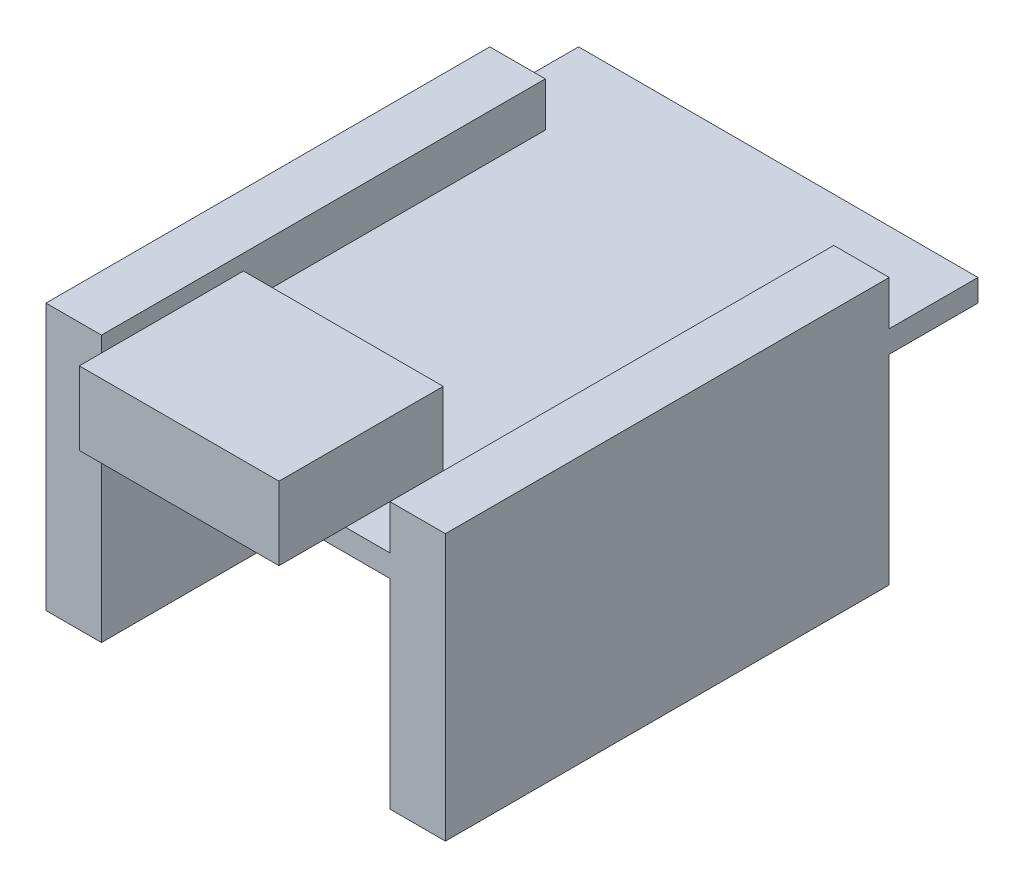
ISO-10303-21;
HEADER;
FILE_DESCRIPTION(('STEP AP214'),'2;1');
FILE_NAME('part.step','',(''),(''),'','','');
FILE_SCHEMA(('AUTOMOTIVE_DESIGN { 1 0 10303 214 1 1 1 1 }'));
ENDSEC;
DATA;
#1=APPLICATION_CONTEXT('core data for automotive mechanical design processes');
#2=APPLICATION_PROTOCOL_DEFINITION('international standard','automotive_design',2000,#1);
#3=PRODUCT_CONTEXT('',#1,'mechanical');
#4=PRODUCT('Part','Part','',(#3));
#5=PRODUCT_RELATED_PRODUCT_CATEGORY('part','',(#4));
#6=PRODUCT_DEFINITION_FORMATION('','',#4);
#7=PRODUCT_DEFINITION_CONTEXT('part definition',#1,'design');
#8=PRODUCT_DEFINITION('design','',#6,#7);
#9=PRODUCT_DEFINITION_SHAPE('','',#8);
#10=(LENGTH_UNIT() NAMED_UNIT(*) SI_UNIT(.MILLI.,.METRE.));
#11=(NAMED_UNIT(*) PLANE_ANGLE_UNIT() SI_UNIT($,.RADIAN.));
#12=(NAMED_UNIT(*) SI_UNIT($,.STERADIAN.) SOLID_ANGLE_UNIT());
#13=UNCERTAINTY_MEASURE_WITH_UNIT(LENGTH_MEASURE(1.E-05),#10,'distance_accuracy_value','');
#14=(GEOMETRIC_REPRESENTATION_CONTEXT(3) GLOBAL_UNCERTAINTY_ASSIGNED_CONTEXT((#13)) GLOBAL_UNIT_ASSIGNED_CONTEXT((#10,
#11,#12)) REPRESENTATION_CONTEXT('',''));
#15=CARTESIAN_POINT('',(0.,0.,0.));
#16=DIRECTION('',(0.,0.,1.));
#17=DIRECTION('',(1.,0.,0.));
#18=AXIS2_PLACEMENT_3D('',#15,#16,#17);
#19=CARTESIAN_POINT('',(9.,1.,-12.));
#20=DIRECTION('',(-1.,0.,0.));
#21=DIRECTION('',(0.,0.,1.));
#22=AXIS2_PLACEMENT_3D('',#19,#20,#21);
#23=PLANE('',#22);
#24=DIRECTION('',(0.,0.,-1.));
#25=VECTOR('',#24,1.);
#26=CARTESIAN_POINT('',(9.,1.,-12.));
#27=LINE('',#26,#25);
#28=CARTESIAN_POINT('',(9.,1.,-8.));
#29=VERTEX_POINT('',#28);
#30=CARTESIAN_POINT('',(9.,1.,-12.));
#31=VERTEX_POINT('',#30);
#32=EDGE_CURVE('E305',#29,#31,#27,.T.);
#33=ORIENTED_EDGE('',*,*,#32,.F.);
#34=DIRECTION('',(0.,-1.,0.));
#35=VECTOR('',#34,1.);
#36=CARTESIAN_POINT('',(9.,3.,-8.));
#37=LINE('',#36,#35);
#38=CARTESIAN_POINT('',(9.,3.,-8.));
#39=VERTEX_POINT('',#38);
#40=EDGE_CURVE('E218',#39,#29,#37,.T.);
#41=ORIENTED_EDGE('',*,*,#40,.F.);
#42=DIRECTION('',(0.,0.,1.));
#43=VECTOR('',#42,1.);
#44=CARTESIAN_POINT('',(9.,3.,12.));
#45=LINE('',#44,#43);
#46=CARTESIAN_POINT('',(9.,3.,12.));
#47=VERTEX_POINT('',#46);
#48=EDGE_CURVE('E187',#39,#47,#45,.T.);
#49=ORIENTED_EDGE('',*,*,#48,.T.);
#50=DIRECTION('',(0.,-1.,0.));
#51=VECTOR('',#50,1.);
#52=CARTESIAN_POINT('',(9.,1.,12.));
#53=LINE('',#52,#51);
#54=CARTESIAN_POINT('',(9.,-9.,12.));
#55=VERTEX_POINT('',#54);
#56=EDGE_CURVE('E314',#47,#55,#53,.T.);
#57=ORIENTED_EDGE('',*,*,#56,.T.);
#58=DIRECTION('',(0.,0.,1.));
#59=VECTOR('',#58,1.);
#60=CARTESIAN_POINT('',(9.,-9.,12.));
#61=LINE('',#60,#59);
#62=CARTESIAN_POINT('',(9.,-9.,-8.));
#63=VERTEX_POINT('',#62);
#64=EDGE_CURVE('E202',#63,#55,#61,.T.);
#65=ORIENTED_EDGE('',*,*,#64,.F.);
#66=CARTESIAN_POINT('',(9.,0.,-8.));
#67=VERTEX_POINT('',#66);
#68=EDGE_CURVE('E221',#67,#63,#37,.T.);
#69=ORIENTED_EDGE('',*,*,#68,.F.);
#70=DIRECTION('',(0.,0.,-1.));
#71=VECTOR('',#70,1.);
#72=CARTESIAN_POINT('',(9.,0.,-12.));
#73=LINE('',#72,#71);
#74=CARTESIAN_POINT('',(9.,0.,-12.));
#75=VERTEX_POINT('',#74);
#76=EDGE_CURVE('E304',#67,#75,#73,.T.);
#77=ORIENTED_EDGE('',*,*,#76,.T.);
#78=DIRECTION('',(0.,-1.,0.));
#79=VECTOR('',#78,1.);
#80=CARTESIAN_POINT('',(9.,1.,-12.));
#81=LINE('',#80,#79);
#82=EDGE_CURVE('E329',#31,#75,#81,.T.);
#83=ORIENTED_EDGE('',*,*,#82,.F.);
#84=EDGE_LOOP('',(#33,#41,#49,#57,#65,#69,#77,#83));
#85=FACE_BOUND('',#84,.T.);
#86=ADVANCED_FACE('F36',(#85),#23,.F.);
#87=CARTESIAN_POINT('',(-9.,1.,-12.));
#88=DIRECTION('',(0.,0.,1.));
#89=DIRECTION('',(1.,0.,0.));
#90=AXIS2_PLACEMENT_3D('',#87,#88,#89);
#91=PLANE('',#90);
#92=DIRECTION('',(-1.,0.,0.));
#93=VECTOR('',#92,1.);
#94=CARTESIAN_POINT('',(-9.,0.,-12.));
#95=LINE('',#94,#93);
#96=CARTESIAN_POINT('',(-9.,0.,-12.));
#97=VERTEX_POINT('',#96);
#98=EDGE_CURVE('E317',#75,#97,#95,.T.);
#99=ORIENTED_EDGE('',*,*,#98,.T.);
#100=DIRECTION('',(0.,-1.,0.));
#101=VECTOR('',#100,1.);
#102=CARTESIAN_POINT('',(-9.,1.,-12.));
#103=LINE('',#102,#101);
#104=CARTESIAN_POINT('',(-9.,1.,-12.));
#105=VERTEX_POINT('',#104);
#106=EDGE_CURVE('E326',#105,#97,#103,.T.);
#107=ORIENTED_EDGE('',*,*,#106,.F.);
#108=DIRECTION('',(-1.,0.,0.));
#109=VECTOR('',#108,1.);
#110=CARTESIAN_POINT('',(-9.,1.,-12.));
#111=LINE('',#110,#109);
#112=EDGE_CURVE('E307',#31,#105,#111,.T.);
#113=ORIENTED_EDGE('',*,*,#112,.F.);
#114=ORIENTED_EDGE('',*,*,#82,.T.);
#115=EDGE_LOOP('',(#99,#107,#113,#114));
#116=FACE_BOUND('',#115,.T.);
#117=ADVANCED_FACE('F394',(#116),#91,.F.);
#118=CARTESIAN_POINT('',(-9.,1.,-12.));
#119=DIRECTION('',(1.,0.,0.));
#120=DIRECTION('',(0.,0.,-1.));
#121=AXIS2_PLACEMENT_3D('',#118,#119,#120);
#122=PLANE('',#121);
#123=DIRECTION('',(0.,0.,1.));
#124=VECTOR('',#123,1.);
#125=CARTESIAN_POINT('',(-9.,0.,-12.));
#126=LINE('',#125,#124);
#127=CARTESIAN_POINT('',(-9.,0.,-8.));
#128=VERTEX_POINT('',#127);
#129=EDGE_CURVE('E319',#97,#128,#126,.T.);
#130=ORIENTED_EDGE('',*,*,#129,.T.);
#131=DIRECTION('',(0.,-1.,0.));
#132=VECTOR('',#131,1.);
#133=CARTESIAN_POINT('',(-9.,3.,-8.));
#134=LINE('',#133,#132);
#135=CARTESIAN_POINT('',(-9.,-9.,-8.));
#136=VERTEX_POINT('',#135);
#137=EDGE_CURVE('E252',#128,#136,#134,.T.);
#138=ORIENTED_EDGE('',*,*,#137,.T.);
#139=DIRECTION('',(0.,0.,-1.));
#140=VECTOR('',#139,1.);
#141=CARTESIAN_POINT('',(-9.,-9.,12.));
#142=LINE('',#141,#140);
#143=CARTESIAN_POINT('',(-9.,-9.,12.));
#144=VERTEX_POINT('',#143);
#145=EDGE_CURVE('E228',#144,#136,#142,.T.);
#146=ORIENTED_EDGE('',*,*,#145,.F.);
#147=DIRECTION('',(0.,-1.,0.));
#148=VECTOR('',#147,1.);
#149=CARTESIAN_POINT('',(-9.,1.,12.));
#150=LINE('',#149,#148);
#151=CARTESIAN_POINT('',(-9.,3.,12.));
#152=VERTEX_POINT('',#151);
#153=EDGE_CURVE('E324',#152,#144,#150,.T.);
#154=ORIENTED_EDGE('',*,*,#153,.F.);
#155=DIRECTION('',(0.,0.,-1.));
#156=VECTOR('',#155,1.);
#157=CARTESIAN_POINT('',(-9.,3.,12.));
#158=LINE('',#157,#156);
#159=CARTESIAN_POINT('',(-9.,3.,-8.));
#160=VERTEX_POINT('',#159);
#161=EDGE_CURVE('E240',#152,#160,#158,.T.);
#162=ORIENTED_EDGE('',*,*,#161,.T.);
#163=CARTESIAN_POINT('',(-9.,1.,-8.));
#164=VERTEX_POINT('',#163);
#165=EDGE_CURVE('E262',#160,#164,#134,.T.);
#166=ORIENTED_EDGE('',*,*,#165,.T.);
#167=DIRECTION('',(0.,0.,1.));
#168=VECTOR('',#167,1.);
#169=CARTESIAN_POINT('',(-9.,1.,-12.));
#170=LINE('',#169,#168);
#171=EDGE_CURVE('E309',#105,#164,#170,.T.);
#172=ORIENTED_EDGE('',*,*,#171,.F.);
#173=ORIENTED_EDGE('',*,*,#106,.T.);
#174=EDGE_LOOP('',(#130,#138,#146,#154,#162,#166,#172,#173));
#175=FACE_BOUND('',#174,.T.);
#176=ADVANCED_FACE('F398',(#175),#122,.F.);
#177=CARTESIAN_POINT('',(-9.,1.,12.));
#178=DIRECTION('',(0.,0.,-1.));
#179=DIRECTION('',(-1.,0.,0.));
#180=AXIS2_PLACEMENT_3D('',#177,#178,#179);
#181=PLANE('',#180);
#182=DIRECTION('',(1.,0.,0.));
#183=VECTOR('',#182,1.);
#184=CARTESIAN_POINT('',(-9.,0.,12.));
#185=LINE('',#184,#183);
#186=CARTESIAN_POINT('',(-6.5,0.,12.));
#187=VERTEX_POINT('',#186);
#188=CARTESIAN_POINT('',(6.5,0.,12.));
#189=VERTEX_POINT('',#188);
#190=EDGE_CURVE('E183',#187,#189,#185,.T.);
#191=ORIENTED_EDGE('',*,*,#190,.T.);
#192=DIRECTION('',(0.,-1.,0.));
#193=VECTOR('',#192,1.);
#194=CARTESIAN_POINT('',(6.5,3.,12.));
#195=LINE('',#194,#193);
#196=CARTESIAN_POINT('',(6.5,-9.,12.));
#197=VERTEX_POINT('',#196);
#198=EDGE_CURVE('E176',#189,#197,#195,.T.);
#199=ORIENTED_EDGE('',*,*,#198,.T.);
#200=DIRECTION('',(-1.,0.,0.));
#201=VECTOR('',#200,1.);
#202=CARTESIAN_POINT('',(9.,-9.,12.));
#203=LINE('',#202,#201);
#204=EDGE_CURVE('E180',#55,#197,#203,.T.);
#205=ORIENTED_EDGE('',*,*,#204,.F.);
#206=ORIENTED_EDGE('',*,*,#56,.F.);
#207=DIRECTION('',(-1.,0.,0.));
#208=VECTOR('',#207,1.);
#209=CARTESIAN_POINT('',(9.,3.,12.));
#210=LINE('',#209,#208);
#211=CARTESIAN_POINT('',(6.5,3.,12.));
#212=VERTEX_POINT('',#211);
#213=EDGE_CURVE('E207',#47,#212,#210,.T.);
#214=ORIENTED_EDGE('',*,*,#213,.T.);
#215=CARTESIAN_POINT('',(6.5,1.,12.));
#216=VERTEX_POINT('',#215);
#217=EDGE_CURVE('E186',#212,#216,#195,.T.);
#218=ORIENTED_EDGE('',*,*,#217,.T.);
#219=DIRECTION('',(1.,0.,0.));
#220=VECTOR('',#219,1.);
#221=CARTESIAN_POINT('',(-9.,1.,12.));
#222=LINE('',#221,#220);
#223=CARTESIAN_POINT('',(4.5,1.,12.));
#224=VERTEX_POINT('',#223);
#225=EDGE_CURVE('E311',#224,#216,#222,.T.);
#226=ORIENTED_EDGE('',*,*,#225,.F.);
#227=CARTESIAN_POINT('',(-4.5,1.,12.));
#228=VERTEX_POINT('',#227);
#229=EDGE_CURVE('E315',#228,#224,#222,.T.);
#230=ORIENTED_EDGE('',*,*,#229,.F.);
#231=CARTESIAN_POINT('',(-6.5,1.,12.));
#232=VERTEX_POINT('',#231);
#233=EDGE_CURVE('E312',#232,#228,#222,.T.);
#234=ORIENTED_EDGE('',*,*,#233,.F.);
#235=DIRECTION('',(0.,-1.,0.));
#236=VECTOR('',#235,1.);
#237=CARTESIAN_POINT('',(-6.5,3.,12.));
#238=LINE('',#237,#236);
#239=CARTESIAN_POINT('',(-6.5,3.,12.));
#240=VERTEX_POINT('',#239);
#241=EDGE_CURVE('E253',#240,#232,#238,.T.);
#242=ORIENTED_EDGE('',*,*,#241,.F.);
#243=DIRECTION('',(-1.,0.,0.));
#244=VECTOR('',#243,1.);
#245=CARTESIAN_POINT('',(-9.,3.,12.));
#246=LINE('',#245,#244);
#247=EDGE_CURVE('E249',#240,#152,#246,.T.);
#248=ORIENTED_EDGE('',*,*,#247,.T.);
#249=ORIENTED_EDGE('',*,*,#153,.T.);
#250=DIRECTION('',(-1.,0.,0.));
#251=VECTOR('',#250,1.);
#252=CARTESIAN_POINT('',(-9.,-9.,12.));
#253=LINE('',#252,#251);
#254=CARTESIAN_POINT('',(-6.5,-9.,12.));
#255=VERTEX_POINT('',#254);
#256=EDGE_CURVE('E237',#255,#144,#253,.T.);
#257=ORIENTED_EDGE('',*,*,#256,.F.);
#258=EDGE_CURVE('E257',#187,#255,#238,.T.);
#259=ORIENTED_EDGE('',*,*,#258,.F.);
#260=EDGE_LOOP('',(#191,#199,#205,#206,#214,#218,#226,#230,#234,#242,#248,#249,#257,#259));
#261=FACE_BOUND('',#260,.T.);
#262=ADVANCED_FACE('F178',(#261),#181,.F.);
#263=CARTESIAN_POINT('',(0.,1.,0.));
#264=DIRECTION('',(0.,1.,0.));
#265=DIRECTION('',(0.,0.,1.));
#266=AXIS2_PLACEMENT_3D('',#263,#264,#265);
#267=PLANE('',#266);
#268=DIRECTION('',(-1.,0.,0.));
#269=VECTOR('',#268,1.);
#270=CARTESIAN_POINT('',(0.,1.,-8.));
#271=LINE('',#270,#269);
#272=CARTESIAN_POINT('',(6.5,1.,-8.));
#273=VERTEX_POINT('',#272);
#274=EDGE_CURVE('E54',#29,#273,#271,.T.);
#275=ORIENTED_EDGE('',*,*,#274,.F.);
#276=ORIENTED_EDGE('',*,*,#32,.T.);
#277=ORIENTED_EDGE('',*,*,#112,.T.);
#278=ORIENTED_EDGE('',*,*,#171,.T.);
#279=DIRECTION('',(-1.,0.,0.));
#280=VECTOR('',#279,1.);
#281=CARTESIAN_POINT('',(0.,1.,-8.));
#282=LINE('',#281,#280);
#283=CARTESIAN_POINT('',(-6.5,1.,-8.));
#284=VERTEX_POINT('',#283);
#285=EDGE_CURVE('E256',#284,#164,#282,.T.);
#286=ORIENTED_EDGE('',*,*,#285,.F.);
#287=DIRECTION('',(0.,0.,-1.));
#288=VECTOR('',#287,1.);
#289=CARTESIAN_POINT('',(-6.5,1.,0.));
#290=LINE('',#289,#288);
#291=EDGE_CURVE('E267',#232,#284,#290,.T.);
#292=ORIENTED_EDGE('',*,*,#291,.F.);
#293=ORIENTED_EDGE('',*,*,#233,.T.);
#294=DIRECTION('',(0.,0.,1.));
#295=VECTOR('',#294,1.);
#296=CARTESIAN_POINT('',(-4.5,1.,7.6));
#297=LINE('',#296,#295);
#298=CARTESIAN_POINT('',(-4.5,1.,7.6));
#299=VERTEX_POINT('',#298);
#300=EDGE_CURVE('E282',#299,#228,#297,.T.);
#301=ORIENTED_EDGE('',*,*,#300,.F.);
#302=DIRECTION('',(-1.,0.,0.));
#303=VECTOR('',#302,1.);
#304=CARTESIAN_POINT('',(-4.5,1.,7.6));
#305=LINE('',#304,#303);
#306=CARTESIAN_POINT('',(4.5,1.,7.6));
#307=VERTEX_POINT('',#306);
#308=EDGE_CURVE('E275',#307,#299,#305,.T.);
#309=ORIENTED_EDGE('',*,*,#308,.F.);
#310=DIRECTION('',(0.,0.,-1.));
#311=VECTOR('',#310,1.);
#312=CARTESIAN_POINT('',(4.5,1.,7.6));
#313=LINE('',#312,#311);
#314=EDGE_CURVE('E290',#224,#307,#313,.T.);
#315=ORIENTED_EDGE('',*,*,#314,.F.);
#316=ORIENTED_EDGE('',*,*,#225,.T.);
#317=DIRECTION('',(0.,0.,1.));
#318=VECTOR('',#317,1.);
#319=CARTESIAN_POINT('',(6.5,1.,0.));
#320=LINE('',#319,#318);
#321=EDGE_CURVE('E50',#273,#216,#320,.T.);
#322=ORIENTED_EDGE('',*,*,#321,.F.);
#323=EDGE_LOOP('',(#275,#276,#277,#278,#286,#292,#293,#301,#309,#315,#316,#322));
#324=FACE_BOUND('',#323,.T.);
#325=ADVANCED_FACE('F374',(#324),#267,.T.);
#326=CARTESIAN_POINT('',(0.,0.,0.));
#327=DIRECTION('',(0.,1.,0.));
#328=DIRECTION('',(0.,0.,1.));
#329=AXIS2_PLACEMENT_3D('',#326,#327,#328);
#330=PLANE('',#329);
#331=ORIENTED_EDGE('',*,*,#76,.F.);
#332=DIRECTION('',(-1.,0.,0.));
#333=VECTOR('',#332,1.);
#334=CARTESIAN_POINT('',(0.,0.,-8.));
#335=LINE('',#334,#333);
#336=CARTESIAN_POINT('',(6.5,0.,-8.));
#337=VERTEX_POINT('',#336);
#338=EDGE_CURVE('E11',#67,#337,#335,.T.);
#339=ORIENTED_EDGE('',*,*,#338,.T.);
#340=DIRECTION('',(0.,0.,1.));
#341=VECTOR('',#340,1.);
#342=CARTESIAN_POINT('',(6.5,0.,0.));
#343=LINE('',#342,#341);
#344=EDGE_CURVE('E43',#337,#189,#343,.T.);
#345=ORIENTED_EDGE('',*,*,#344,.T.);
#346=ORIENTED_EDGE('',*,*,#190,.F.);
#347=DIRECTION('',(0.,0.,-1.));
#348=VECTOR('',#347,1.);
#349=CARTESIAN_POINT('',(-6.5,0.,0.));
#350=LINE('',#349,#348);
#351=CARTESIAN_POINT('',(-6.5,0.,-8.));
#352=VERTEX_POINT('',#351);
#353=EDGE_CURVE('E335',#187,#352,#350,.T.);
#354=ORIENTED_EDGE('',*,*,#353,.T.);
#355=DIRECTION('',(-1.,0.,0.));
#356=VECTOR('',#355,1.);
#357=CARTESIAN_POINT('',(0.,0.,-8.));
#358=LINE('',#357,#356);
#359=EDGE_CURVE('E332',#352,#128,#358,.T.);
#360=ORIENTED_EDGE('',*,*,#359,.T.);
#361=ORIENTED_EDGE('',*,*,#129,.F.);
#362=ORIENTED_EDGE('',*,*,#98,.F.);
#363=EDGE_LOOP('',(#331,#339,#345,#346,#354,#360,#361,#362));
#364=FACE_BOUND('',#363,.T.);
#365=ADVANCED_FACE('F339',(#364),#330,.F.);
#366=CARTESIAN_POINT('',(0.,1.,0.));
#367=DIRECTION('',(0.,1.,0.));
#368=DIRECTION('',(0.,0.,1.));
#369=AXIS2_PLACEMENT_3D('',#366,#367,#368);
#370=PLANE('',#369);
#371=CARTESIAN_POINT('',(-4.5,1.,15.));
#372=VERTEX_POINT('',#371);
#373=EDGE_CURVE('E270',#228,#372,#297,.T.);
#374=ORIENTED_EDGE('',*,*,#373,.F.);
#375=ORIENTED_EDGE('',*,*,#229,.T.);
#376=CARTESIAN_POINT('',(4.5,1.,15.));
#377=VERTEX_POINT('',#376);
#378=EDGE_CURVE('E287',#377,#224,#313,.T.);
#379=ORIENTED_EDGE('',*,*,#378,.F.);
#380=DIRECTION('',(1.,0.,0.));
#381=VECTOR('',#380,1.);
#382=CARTESIAN_POINT('',(-4.5,1.,15.));
#383=LINE('',#382,#381);
#384=EDGE_CURVE('E285',#372,#377,#383,.T.);
#385=ORIENTED_EDGE('',*,*,#384,.F.);
#386=EDGE_LOOP('',(#374,#375,#379,#385));
#387=FACE_BOUND('',#386,.T.);
#388=ADVANCED_FACE('F359',(#387),#370,.F.);
#389=CARTESIAN_POINT('',(-4.5,4.3,7.6));
#390=DIRECTION('',(1.,0.,0.));
#391=DIRECTION('',(0.,0.,-1.));
#392=AXIS2_PLACEMENT_3D('',#389,#390,#391);
#393=PLANE('',#392);
#394=ORIENTED_EDGE('',*,*,#300,.T.);
#395=ORIENTED_EDGE('',*,*,#373,.T.);
#396=DIRECTION('',(0.,-1.,0.));
#397=VECTOR('',#396,1.);
#398=CARTESIAN_POINT('',(-4.5,4.3,15.));
#399=LINE('',#398,#397);
#400=CARTESIAN_POINT('',(-4.5,4.3,15.));
#401=VERTEX_POINT('',#400);
#402=EDGE_CURVE('E301',#401,#372,#399,.T.);
#403=ORIENTED_EDGE('',*,*,#402,.F.);
#404=DIRECTION('',(0.,0.,1.));
#405=VECTOR('',#404,1.);
#406=CARTESIAN_POINT('',(-4.5,4.3,7.6));
#407=LINE('',#406,#405);
#408=CARTESIAN_POINT('',(-4.5,4.3,7.6));
#409=VERTEX_POINT('',#408);
#410=EDGE_CURVE('E271',#409,#401,#407,.T.);
#411=ORIENTED_EDGE('',*,*,#410,.F.);
#412=DIRECTION('',(0.,-1.,0.));
#413=VECTOR('',#412,1.);
#414=CARTESIAN_POINT('',(-4.5,4.3,7.6));
#415=LINE('',#414,#413);
#416=EDGE_CURVE('E281',#409,#299,#415,.T.);
#417=ORIENTED_EDGE('',*,*,#416,.T.);
#418=EDGE_LOOP('',(#394,#395,#403,#411,#417));
#419=FACE_BOUND('',#418,.T.);
#420=ADVANCED_FACE('F372',(#419),#393,.F.);
#421=CARTESIAN_POINT('',(-4.5,4.3,15.));
#422=DIRECTION('',(0.,0.,-1.));
#423=DIRECTION('',(-1.,0.,0.));
#424=AXIS2_PLACEMENT_3D('',#421,#422,#423);
#425=PLANE('',#424);
#426=ORIENTED_EDGE('',*,*,#384,.T.);
#427=DIRECTION('',(0.,-1.,0.));
#428=VECTOR('',#427,1.);
#429=CARTESIAN_POINT('',(4.5,4.3,15.));
#430=LINE('',#429,#428);
#431=CARTESIAN_POINT('',(4.5,4.3,15.));
#432=VERTEX_POINT('',#431);
#433=EDGE_CURVE('E298',#432,#377,#430,.T.);
#434=ORIENTED_EDGE('',*,*,#433,.F.);
#435=DIRECTION('',(1.,0.,0.));
#436=VECTOR('',#435,1.);
#437=CARTESIAN_POINT('',(-4.5,4.3,15.));
#438=LINE('',#437,#436);
#439=EDGE_CURVE('E274',#401,#432,#438,.T.);
#440=ORIENTED_EDGE('',*,*,#439,.F.);
#441=ORIENTED_EDGE('',*,*,#402,.T.);
#442=EDGE_LOOP('',(#426,#434,#440,#441));
#443=FACE_BOUND('',#442,.T.);
#444=ADVANCED_FACE('F368',(#443),#425,.F.);
#445=CARTESIAN_POINT('',(4.5,4.3,7.6));
#446=DIRECTION('',(-1.,0.,0.));
#447=DIRECTION('',(0.,0.,1.));
#448=AXIS2_PLACEMENT_3D('',#445,#446,#447);
#449=PLANE('',#448);
#450=ORIENTED_EDGE('',*,*,#378,.T.);
#451=ORIENTED_EDGE('',*,*,#314,.T.);
#452=DIRECTION('',(0.,-1.,0.));
#453=VECTOR('',#452,1.);
#454=CARTESIAN_POINT('',(4.5,4.3,7.6));
#455=LINE('',#454,#453);
#456=CARTESIAN_POINT('',(4.5,4.3,7.6));
#457=VERTEX_POINT('',#456);
#458=EDGE_CURVE('E295',#457,#307,#455,.T.);
#459=ORIENTED_EDGE('',*,*,#458,.F.);
#460=DIRECTION('',(0.,0.,-1.));
#461=VECTOR('',#460,1.);
#462=CARTESIAN_POINT('',(4.5,4.3,7.6));
#463=LINE('',#462,#461);
#464=EDGE_CURVE('E277',#432,#457,#463,.T.);
#465=ORIENTED_EDGE('',*,*,#464,.F.);
#466=ORIENTED_EDGE('',*,*,#433,.T.);
#467=EDGE_LOOP('',(#450,#451,#459,#465,#466));
#468=FACE_BOUND('',#467,.T.);
#469=ADVANCED_FACE('F363',(#468),#449,.F.);
#470=CARTESIAN_POINT('',(-4.5,4.3,7.6));
#471=DIRECTION('',(0.,0.,1.));
#472=DIRECTION('',(1.,0.,0.));
#473=AXIS2_PLACEMENT_3D('',#470,#471,#472);
#474=PLANE('',#473);
#475=ORIENTED_EDGE('',*,*,#308,.T.);
#476=ORIENTED_EDGE('',*,*,#416,.F.);
#477=DIRECTION('',(-1.,0.,0.));
#478=VECTOR('',#477,1.);
#479=CARTESIAN_POINT('',(-4.5,4.3,7.6));
#480=LINE('',#479,#478);
#481=EDGE_CURVE('E279',#457,#409,#480,.T.);
#482=ORIENTED_EDGE('',*,*,#481,.F.);
#483=ORIENTED_EDGE('',*,*,#458,.T.);
#484=EDGE_LOOP('',(#475,#476,#482,#483));
#485=FACE_BOUND('',#484,.T.);
#486=ADVANCED_FACE('F376',(#485),#474,.F.);
#487=CARTESIAN_POINT('',(0.,4.3,0.));
#488=DIRECTION('',(0.,1.,0.));
#489=DIRECTION('',(0.,0.,1.));
#490=AXIS2_PLACEMENT_3D('',#487,#488,#489);
#491=PLANE('',#490);
#492=ORIENTED_EDGE('',*,*,#410,.T.);
#493=ORIENTED_EDGE('',*,*,#439,.T.);
#494=ORIENTED_EDGE('',*,*,#464,.T.);
#495=ORIENTED_EDGE('',*,*,#481,.T.);
#496=EDGE_LOOP('',(#492,#493,#494,#495));
#497=FACE_BOUND('',#496,.T.);
#498=ADVANCED_FACE('F379',(#497),#491,.T.);
#499=CARTESIAN_POINT('',(0.,-9.,0.));
#500=DIRECTION('',(0.,-1.,0.));
#501=DIRECTION('',(0.,0.,-1.));
#502=AXIS2_PLACEMENT_3D('',#499,#500,#501);
#503=PLANE('',#502);
#504=ORIENTED_EDGE('',*,*,#145,.T.);
#505=DIRECTION('',(1.,0.,0.));
#506=VECTOR('',#505,1.);
#507=CARTESIAN_POINT('',(-9.,-9.,-8.));
#508=LINE('',#507,#506);
#509=CARTESIAN_POINT('',(-6.5,-9.,-8.));
#510=VERTEX_POINT('',#509);
#511=EDGE_CURVE('E231',#136,#510,#508,.T.);
#512=ORIENTED_EDGE('',*,*,#511,.T.);
#513=DIRECTION('',(0.,0.,1.));
#514=VECTOR('',#513,1.);
#515=CARTESIAN_POINT('',(-6.5,-9.,12.));
#516=LINE('',#515,#514);
#517=EDGE_CURVE('E234',#510,#255,#516,.T.);
#518=ORIENTED_EDGE('',*,*,#517,.T.);
#519=ORIENTED_EDGE('',*,*,#256,.T.);
#520=EDGE_LOOP('',(#504,#512,#518,#519));
#521=FACE_BOUND('',#520,.T.);
#522=ADVANCED_FACE('F381',(#521),#503,.T.);
#523=CARTESIAN_POINT('',(-9.,3.,-8.));
#524=DIRECTION('',(0.,0.,-1.));
#525=DIRECTION('',(-1.,0.,0.));
#526=AXIS2_PLACEMENT_3D('',#523,#524,#525);
#527=PLANE('',#526);
#528=ORIENTED_EDGE('',*,*,#359,.F.);
#529=DIRECTION('',(0.,-1.,0.));
#530=VECTOR('',#529,1.);
#531=CARTESIAN_POINT('',(-6.5,3.,-8.));
#532=LINE('',#531,#530);
#533=EDGE_CURVE('E261',#352,#510,#532,.T.);
#534=ORIENTED_EDGE('',*,*,#533,.T.);
#535=ORIENTED_EDGE('',*,*,#511,.F.);
#536=ORIENTED_EDGE('',*,*,#137,.F.);
#537=EDGE_LOOP('',(#528,#534,#535,#536));
#538=FACE_BOUND('',#537,.T.);
#539=ADVANCED_FACE('F387',(#538),#527,.T.);
#540=CARTESIAN_POINT('',(-6.5,3.,12.));
#541=DIRECTION('',(1.,0.,0.));
#542=DIRECTION('',(0.,0.,-1.));
#543=AXIS2_PLACEMENT_3D('',#540,#541,#542);
#544=PLANE('',#543);
#545=ORIENTED_EDGE('',*,*,#353,.F.);
#546=ORIENTED_EDGE('',*,*,#258,.T.);
#547=ORIENTED_EDGE('',*,*,#517,.F.);
#548=ORIENTED_EDGE('',*,*,#533,.F.);
#549=EDGE_LOOP('',(#545,#546,#547,#548));
#550=FACE_BOUND('',#549,.T.);
#551=ADVANCED_FACE('F487',(#550),#544,.T.);
#552=ORIENTED_EDGE('',*,*,#241,.T.);
#553=ORIENTED_EDGE('',*,*,#291,.T.);
#554=CARTESIAN_POINT('',(-6.5,3.,-8.));
#555=VERTEX_POINT('',#554);
#556=EDGE_CURVE('E258',#555,#284,#532,.T.);
#557=ORIENTED_EDGE('',*,*,#556,.F.);
#558=DIRECTION('',(0.,0.,1.));
#559=VECTOR('',#558,1.);
#560=CARTESIAN_POINT('',(-6.5,3.,12.));
#561=LINE('',#560,#559);
#562=EDGE_CURVE('E246',#555,#240,#561,.T.);
#563=ORIENTED_EDGE('',*,*,#562,.T.);
#564=EDGE_LOOP('',(#552,#553,#557,#563));
#565=FACE_BOUND('',#564,.T.);
#566=ADVANCED_FACE('F497',(#565),#544,.T.);
#567=ORIENTED_EDGE('',*,*,#556,.T.);
#568=ORIENTED_EDGE('',*,*,#285,.T.);
#569=ORIENTED_EDGE('',*,*,#165,.F.);
#570=DIRECTION('',(1.,0.,0.));
#571=VECTOR('',#570,1.);
#572=CARTESIAN_POINT('',(-9.,3.,-8.));
#573=LINE('',#572,#571);
#574=EDGE_CURVE('E243',#160,#555,#573,.T.);
#575=ORIENTED_EDGE('',*,*,#574,.T.);
#576=EDGE_LOOP('',(#567,#568,#569,#575));
#577=FACE_BOUND('',#576,.T.);
#578=ADVANCED_FACE('F489',(#577),#527,.T.);
#579=CARTESIAN_POINT('',(0.,3.,0.));
#580=DIRECTION('',(0.,-1.,0.));
#581=DIRECTION('',(0.,0.,-1.));
#582=AXIS2_PLACEMENT_3D('',#579,#580,#581);
#583=PLANE('',#582);
#584=ORIENTED_EDGE('',*,*,#161,.F.);
#585=ORIENTED_EDGE('',*,*,#247,.F.);
#586=ORIENTED_EDGE('',*,*,#562,.F.);
#587=ORIENTED_EDGE('',*,*,#574,.F.);
#588=EDGE_LOOP('',(#584,#585,#586,#587));
#589=FACE_BOUND('',#588,.T.);
#590=ADVANCED_FACE('F515',(#589),#583,.F.);
#591=CARTESIAN_POINT('',(0.,-9.,0.));
#592=DIRECTION('',(0.,-1.,0.));
#593=DIRECTION('',(0.,0.,-1.));
#594=AXIS2_PLACEMENT_3D('',#591,#592,#593);
#595=PLANE('',#594);
#596=ORIENTED_EDGE('',*,*,#204,.T.);
#597=DIRECTION('',(0.,0.,-1.));
#598=VECTOR('',#597,1.);
#599=CARTESIAN_POINT('',(6.5,-9.,12.));
#600=LINE('',#599,#598);
#601=CARTESIAN_POINT('',(6.5,-9.,-8.));
#602=VERTEX_POINT('',#601);
#603=EDGE_CURVE('E190',#197,#602,#600,.T.);
#604=ORIENTED_EDGE('',*,*,#603,.T.);
#605=DIRECTION('',(1.,0.,0.));
#606=VECTOR('',#605,1.);
#607=CARTESIAN_POINT('',(9.,-9.,-8.));
#608=LINE('',#607,#606);
#609=EDGE_CURVE('E197',#602,#63,#608,.T.);
#610=ORIENTED_EDGE('',*,*,#609,.T.);
#611=ORIENTED_EDGE('',*,*,#64,.T.);
#612=EDGE_LOOP('',(#596,#604,#610,#611));
#613=FACE_BOUND('',#612,.T.);
#614=ADVANCED_FACE('F200',(#613),#595,.T.);
#615=CARTESIAN_POINT('',(6.5,3.,12.));
#616=DIRECTION('',(-1.,0.,0.));
#617=DIRECTION('',(0.,0.,1.));
#618=AXIS2_PLACEMENT_3D('',#615,#616,#617);
#619=PLANE('',#618);
#620=ORIENTED_EDGE('',*,*,#344,.F.);
#621=DIRECTION('',(0.,-1.,0.));
#622=VECTOR('',#621,1.);
#623=CARTESIAN_POINT('',(6.5,3.,-8.));
#624=LINE('',#623,#622);
#625=EDGE_CURVE('E193',#337,#602,#624,.T.);
#626=ORIENTED_EDGE('',*,*,#625,.T.);
#627=ORIENTED_EDGE('',*,*,#603,.F.);
#628=ORIENTED_EDGE('',*,*,#198,.F.);
#629=EDGE_LOOP('',(#620,#626,#627,#628));
#630=FACE_BOUND('',#629,.T.);
#631=ADVANCED_FACE('F191',(#630),#619,.T.);
#632=CARTESIAN_POINT('',(9.,3.,-8.));
#633=DIRECTION('',(0.,0.,-1.));
#634=DIRECTION('',(-1.,0.,0.));
#635=AXIS2_PLACEMENT_3D('',#632,#633,#634);
#636=PLANE('',#635);
#637=ORIENTED_EDGE('',*,*,#338,.F.);
#638=ORIENTED_EDGE('',*,*,#68,.T.);
#639=ORIENTED_EDGE('',*,*,#609,.F.);
#640=ORIENTED_EDGE('',*,*,#625,.F.);
#641=EDGE_LOOP('',(#637,#638,#639,#640));
#642=FACE_BOUND('',#641,.T.);
#643=ADVANCED_FACE('F341',(#642),#636,.T.);
#644=ORIENTED_EDGE('',*,*,#40,.T.);
#645=ORIENTED_EDGE('',*,*,#274,.T.);
#646=CARTESIAN_POINT('',(6.5,3.,-8.));
#647=VERTEX_POINT('',#646);
#648=EDGE_CURVE('E222',#647,#273,#624,.T.);
#649=ORIENTED_EDGE('',*,*,#648,.F.);
#650=DIRECTION('',(1.,0.,0.));
#651=VECTOR('',#650,1.);
#652=CARTESIAN_POINT('',(9.,3.,-8.));
#653=LINE('',#652,#651);
#654=EDGE_CURVE('E213',#647,#39,#653,.T.);
#655=ORIENTED_EDGE('',*,*,#654,.T.);
#656=EDGE_LOOP('',(#644,#645,#649,#655));
#657=FACE_BOUND('',#656,.T.);
#658=ADVANCED_FACE('F549',(#657),#636,.T.);
#659=ORIENTED_EDGE('',*,*,#648,.T.);
#660=ORIENTED_EDGE('',*,*,#321,.T.);
#661=ORIENTED_EDGE('',*,*,#217,.F.);
#662=DIRECTION('',(0.,0.,-1.));
#663=VECTOR('',#662,1.);
#664=CARTESIAN_POINT('',(6.5,3.,12.));
#665=LINE('',#664,#663);
#666=EDGE_CURVE('E210',#212,#647,#665,.T.);
#667=ORIENTED_EDGE('',*,*,#666,.T.);
#668=EDGE_LOOP('',(#659,#660,#661,#667));
#669=FACE_BOUND('',#668,.T.);
#670=ADVANCED_FACE('F351',(#669),#619,.T.);
#671=CARTESIAN_POINT('',(0.,3.,0.));
#672=DIRECTION('',(0.,-1.,0.));
#673=DIRECTION('',(0.,0.,-1.));
#674=AXIS2_PLACEMENT_3D('',#671,#672,#673);
#675=PLANE('',#674);
#676=ORIENTED_EDGE('',*,*,#213,.F.);
#677=ORIENTED_EDGE('',*,*,#48,.F.);
#678=ORIENTED_EDGE('',*,*,#654,.F.);
#679=ORIENTED_EDGE('',*,*,#666,.F.);
#680=EDGE_LOOP('',(#676,#677,#678,#679));
#681=FACE_BOUND('',#680,.T.);
#682=ADVANCED_FACE('F348',(#681),#675,.F.);
#683=CLOSED_SHELL('',(#86,#117,#176,#262,#325,#365,#388,#420,#444,#469,#486,#498,#522,#539,#551,
#566,#578,#590,#614,#631,#643,#658,#670,#682));
#684=MANIFOLD_SOLID_BREP('B2',#683);
#685=ADVANCED_BREP_SHAPE_REPRESENTATION('',(#18,#684),#14);
#686=SHAPE_DEFINITION_REPRESENTATION(#9,#685);
ENDSEC;
END-ISO-10303-21;
